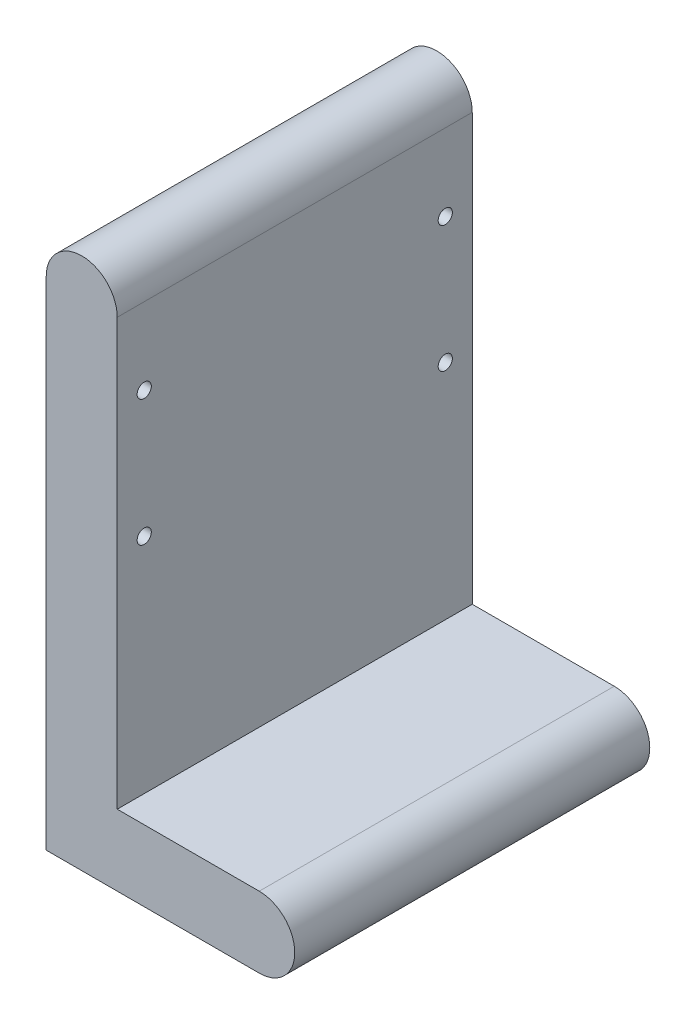
ISO-10303-21;
HEADER;
FILE_DESCRIPTION(('STEP AP214'),'2;1');
FILE_NAME('part.step','',(''),(''),'','','');
FILE_SCHEMA(('AUTOMOTIVE_DESIGN { 1 0 10303 214 1 1 1 1 }'));
ENDSEC;
DATA;
#1=APPLICATION_CONTEXT('core data for automotive mechanical design processes');
#2=APPLICATION_PROTOCOL_DEFINITION('international standard','automotive_design',2000,#1);
#3=PRODUCT_CONTEXT('',#1,'mechanical');
#4=PRODUCT('Part','Part','',(#3));
#5=PRODUCT_RELATED_PRODUCT_CATEGORY('part','',(#4));
#6=PRODUCT_DEFINITION_FORMATION('','',#4);
#7=PRODUCT_DEFINITION_CONTEXT('part definition',#1,'design');
#8=PRODUCT_DEFINITION('design','',#6,#7);
#9=PRODUCT_DEFINITION_SHAPE('','',#8);
#10=(LENGTH_UNIT() NAMED_UNIT(*) SI_UNIT(.MILLI.,.METRE.));
#11=(NAMED_UNIT(*) PLANE_ANGLE_UNIT() SI_UNIT($,.RADIAN.));
#12=(NAMED_UNIT(*) SI_UNIT($,.STERADIAN.) SOLID_ANGLE_UNIT());
#13=UNCERTAINTY_MEASURE_WITH_UNIT(LENGTH_MEASURE(1.E-05),#10,'distance_accuracy_value','');
#14=(GEOMETRIC_REPRESENTATION_CONTEXT(3) GLOBAL_UNCERTAINTY_ASSIGNED_CONTEXT((#13)) GLOBAL_UNIT_ASSIGNED_CONTEXT((#10,
#11,#12)) REPRESENTATION_CONTEXT('',''));
#15=CARTESIAN_POINT('',(0.,0.,0.));
#16=DIRECTION('',(0.,0.,1.));
#17=DIRECTION('',(1.,0.,0.));
#18=AXIS2_PLACEMENT_3D('',#15,#16,#17);
#19=CARTESIAN_POINT('',(-10.,60.,50.));
#20=DIRECTION('',(1.,0.,0.));
#21=DIRECTION('',(0.,1.,0.));
#22=AXIS2_PLACEMENT_3D('',#19,#20,#21);
#23=PLANE('',#22);
#24=CARTESIAN_POINT('',(-10.,49.2,46.2));
#25=DIRECTION('',(1.,0.,0.));
#26=DIRECTION('',(0.,0.,-1.));
#27=AXIS2_PLACEMENT_3D('',#24,#25,#26);
#28=CIRCLE('',#27,0.999999999999998);
#29=CARTESIAN_POINT('',(-10.,49.2,45.2));
#30=VERTEX_POINT('',#29);
#31=EDGE_CURVE('E160',#30,#30,#28,.T.);
#32=ORIENTED_EDGE('',*,*,#31,.T.);
#33=EDGE_LOOP('',(#32));
#34=FACE_BOUND('',#33,.T.);
#35=CARTESIAN_POINT('',(-10.,49.2,3.8));
#36=DIRECTION('',(-1.,0.,0.));
#37=DIRECTION('',(0.,0.,1.));
#38=AXIS2_PLACEMENT_3D('',#35,#36,#37);
#39=CIRCLE('',#38,1.);
#40=CARTESIAN_POINT('',(-10.,49.2,4.8));
#41=VERTEX_POINT('',#40);
#42=EDGE_CURVE('E177',#41,#41,#39,.T.);
#43=ORIENTED_EDGE('',*,*,#42,.F.);
#44=EDGE_LOOP('',(#43));
#45=FACE_BOUND('',#44,.T.);
#46=CARTESIAN_POINT('',(-10.,31.4,46.2));
#47=DIRECTION('',(-1.,0.,0.));
#48=DIRECTION('',(0.,0.,1.));
#49=AXIS2_PLACEMENT_3D('',#46,#47,#48);
#50=CIRCLE('',#49,1.00000000000001);
#51=CARTESIAN_POINT('',(-10.,31.4,47.2));
#52=VERTEX_POINT('',#51);
#53=EDGE_CURVE('E174',#52,#52,#50,.F.);
#54=ORIENTED_EDGE('',*,*,#53,.T.);
#55=EDGE_LOOP('',(#54));
#56=FACE_BOUND('',#55,.T.);
#57=DIRECTION('',(0.,-1.,0.));
#58=VECTOR('',#57,1.);
#59=CARTESIAN_POINT('',(-10.,60.,0.));
#60=LINE('',#59,#58);
#61=CARTESIAN_POINT('',(-10.,60.,0.));
#62=VERTEX_POINT('',#61);
#63=CARTESIAN_POINT('',(-10.,-10.,0.));
#64=VERTEX_POINT('',#63);
#65=EDGE_CURVE('E129',#62,#64,#60,.T.);
#66=ORIENTED_EDGE('',*,*,#65,.T.);
#67=DIRECTION('',(0.,0.,-1.));
#68=VECTOR('',#67,1.);
#69=CARTESIAN_POINT('',(-10.,-10.,50.));
#70=LINE('',#69,#68);
#71=CARTESIAN_POINT('',(-10.,-10.,50.));
#72=VERTEX_POINT('',#71);
#73=EDGE_CURVE('E50',#72,#64,#70,.T.);
#74=ORIENTED_EDGE('',*,*,#73,.F.);
#75=DIRECTION('',(0.,-1.,0.));
#76=VECTOR('',#75,1.);
#77=CARTESIAN_POINT('',(-10.,60.,50.));
#78=LINE('',#77,#76);
#79=CARTESIAN_POINT('',(-10.,60.,50.));
#80=VERTEX_POINT('',#79);
#81=EDGE_CURVE('E95',#80,#72,#78,.T.);
#82=ORIENTED_EDGE('',*,*,#81,.F.);
#83=DIRECTION('',(0.,0.,-1.));
#84=VECTOR('',#83,1.);
#85=CARTESIAN_POINT('',(-10.,60.,50.));
#86=LINE('',#85,#84);
#87=EDGE_CURVE('E11',#80,#62,#86,.T.);
#88=ORIENTED_EDGE('',*,*,#87,.T.);
#89=EDGE_LOOP('',(#66,#74,#82,#88));
#90=FACE_BOUND('',#89,.T.);
#91=CARTESIAN_POINT('',(-10.,31.4,3.8));
#92=DIRECTION('',(-1.,0.,0.));
#93=DIRECTION('',(0.,0.,1.));
#94=AXIS2_PLACEMENT_3D('',#91,#92,#93);
#95=CIRCLE('',#94,1.);
#96=CARTESIAN_POINT('',(-10.,31.4,4.8));
#97=VERTEX_POINT('',#96);
#98=EDGE_CURVE('E159',#97,#97,#95,.T.);
#99=ORIENTED_EDGE('',*,*,#98,.F.);
#100=EDGE_LOOP('',(#99));
#101=FACE_BOUND('',#100,.T.);
#102=ADVANCED_FACE('F41',(#34,#45,#56,#90,#101),#23,.F.);
#103=CARTESIAN_POINT('',(0.,60.,50.));
#104=DIRECTION('',(-1.,0.,0.));
#105=DIRECTION('',(0.,-1.,0.));
#106=AXIS2_PLACEMENT_3D('',#103,#104,#105);
#107=PLANE('',#106);
#108=CARTESIAN_POINT('',(0.,49.2,46.2));
#109=DIRECTION('',(1.,0.,0.));
#110=DIRECTION('',(0.,0.,-1.));
#111=AXIS2_PLACEMENT_3D('',#108,#109,#110);
#112=CIRCLE('',#111,0.999999999999998);
#113=CARTESIAN_POINT('',(0.,49.2,45.2));
#114=VERTEX_POINT('',#113);
#115=EDGE_CURVE('E166',#114,#114,#112,.T.);
#116=ORIENTED_EDGE('',*,*,#115,.F.);
#117=EDGE_LOOP('',(#116));
#118=FACE_BOUND('',#117,.T.);
#119=CARTESIAN_POINT('',(0.,49.2,3.8));
#120=DIRECTION('',(-1.,0.,0.));
#121=DIRECTION('',(0.,0.,1.));
#122=AXIS2_PLACEMENT_3D('',#119,#120,#121);
#123=CIRCLE('',#122,1.);
#124=CARTESIAN_POINT('',(0.,49.2,4.8));
#125=VERTEX_POINT('',#124);
#126=EDGE_CURVE('E163',#125,#125,#123,.T.);
#127=ORIENTED_EDGE('',*,*,#126,.T.);
#128=EDGE_LOOP('',(#127));
#129=FACE_BOUND('',#128,.T.);
#130=CARTESIAN_POINT('',(0.,31.4,46.2));
#131=DIRECTION('',(-1.,0.,0.));
#132=DIRECTION('',(0.,0.,1.));
#133=AXIS2_PLACEMENT_3D('',#130,#131,#132);
#134=CIRCLE('',#133,1.00000000000001);
#135=CARTESIAN_POINT('',(0.,31.4,47.2));
#136=VERTEX_POINT('',#135);
#137=EDGE_CURVE('E130',#136,#136,#134,.F.);
#138=ORIENTED_EDGE('',*,*,#137,.F.);
#139=EDGE_LOOP('',(#138));
#140=FACE_BOUND('',#139,.T.);
#141=DIRECTION('',(0.,1.,0.));
#142=VECTOR('',#141,1.);
#143=CARTESIAN_POINT('',(0.,60.,0.));
#144=LINE('',#143,#142);
#145=CARTESIAN_POINT('',(0.,0.,0.));
#146=VERTEX_POINT('',#145);
#147=CARTESIAN_POINT('',(0.,60.,0.));
#148=VERTEX_POINT('',#147);
#149=EDGE_CURVE('E87',#146,#148,#144,.T.);
#150=ORIENTED_EDGE('',*,*,#149,.T.);
#151=DIRECTION('',(0.,0.,-1.));
#152=VECTOR('',#151,1.);
#153=CARTESIAN_POINT('',(0.,60.,50.));
#154=LINE('',#153,#152);
#155=CARTESIAN_POINT('',(0.,60.,50.));
#156=VERTEX_POINT('',#155);
#157=EDGE_CURVE('E122',#156,#148,#154,.T.);
#158=ORIENTED_EDGE('',*,*,#157,.F.);
#159=DIRECTION('',(0.,1.,0.));
#160=VECTOR('',#159,1.);
#161=CARTESIAN_POINT('',(0.,60.,50.));
#162=LINE('',#161,#160);
#163=CARTESIAN_POINT('',(0.,0.,50.));
#164=VERTEX_POINT('',#163);
#165=EDGE_CURVE('E58',#164,#156,#162,.T.);
#166=ORIENTED_EDGE('',*,*,#165,.F.);
#167=DIRECTION('',(0.,0.,-1.));
#168=VECTOR('',#167,1.);
#169=CARTESIAN_POINT('',(0.,0.,50.));
#170=LINE('',#169,#168);
#171=EDGE_CURVE('E118',#164,#146,#170,.T.);
#172=ORIENTED_EDGE('',*,*,#171,.T.);
#173=EDGE_LOOP('',(#150,#158,#166,#172));
#174=FACE_BOUND('',#173,.T.);
#175=CARTESIAN_POINT('',(0.,31.4,3.8));
#176=DIRECTION('',(-1.,0.,0.));
#177=DIRECTION('',(0.,0.,1.));
#178=AXIS2_PLACEMENT_3D('',#175,#176,#177);
#179=CIRCLE('',#178,1.);
#180=CARTESIAN_POINT('',(0.,31.4,4.8));
#181=VERTEX_POINT('',#180);
#182=EDGE_CURVE('E157',#181,#181,#179,.T.);
#183=ORIENTED_EDGE('',*,*,#182,.T.);
#184=EDGE_LOOP('',(#183));
#185=FACE_BOUND('',#184,.T.);
#186=ADVANCED_FACE('F150',(#118,#129,#140,#174,#185),#107,.F.);
#187=CARTESIAN_POINT('',(-5.00000000000001,60.,50.));
#188=DIRECTION('',(0.,0.,-1.));
#189=DIRECTION('',(-1.,0.,0.));
#190=AXIS2_PLACEMENT_3D('',#187,#188,#189);
#191=CYLINDRICAL_SURFACE('',#190,5.);
#192=CARTESIAN_POINT('',(-5.00000000000001,60.,0.));
#193=DIRECTION('',(0.,0.,1.));
#194=DIRECTION('',(1.,0.,0.));
#195=AXIS2_PLACEMENT_3D('',#192,#193,#194);
#196=CIRCLE('',#195,5.);
#197=EDGE_CURVE('E126',#148,#62,#196,.T.);
#198=ORIENTED_EDGE('',*,*,#197,.T.);
#199=ORIENTED_EDGE('',*,*,#87,.F.);
#200=CARTESIAN_POINT('',(-5.00000000000001,60.,50.));
#201=DIRECTION('',(0.,0.,1.));
#202=DIRECTION('',(1.,0.,0.));
#203=AXIS2_PLACEMENT_3D('',#200,#201,#202);
#204=CIRCLE('',#203,5.);
#205=EDGE_CURVE('E137',#156,#80,#204,.T.);
#206=ORIENTED_EDGE('',*,*,#205,.F.);
#207=ORIENTED_EDGE('',*,*,#157,.T.);
#208=EDGE_LOOP('',(#198,#199,#206,#207));
#209=FACE_BOUND('',#208,.T.);
#210=ADVANCED_FACE('F43',(#209),#191,.T.);
#211=CARTESIAN_POINT('',(-10.,-10.,50.));
#212=DIRECTION('',(0.,1.,0.));
#213=DIRECTION('',(0.,0.,1.));
#214=AXIS2_PLACEMENT_3D('',#211,#212,#213);
#215=PLANE('',#214);
#216=DIRECTION('',(1.,0.,0.));
#217=VECTOR('',#216,1.);
#218=CARTESIAN_POINT('',(-10.,-10.,0.));
#219=LINE('',#218,#217);
#220=CARTESIAN_POINT('',(20.,-10.,0.));
#221=VERTEX_POINT('',#220);
#222=EDGE_CURVE('E132',#64,#221,#219,.T.);
#223=ORIENTED_EDGE('',*,*,#222,.T.);
#224=DIRECTION('',(0.,0.,-1.));
#225=VECTOR('',#224,1.);
#226=CARTESIAN_POINT('',(20.,-10.,50.));
#227=LINE('',#226,#225);
#228=CARTESIAN_POINT('',(20.,-10.,50.));
#229=VERTEX_POINT('',#228);
#230=EDGE_CURVE('E117',#229,#221,#227,.T.);
#231=ORIENTED_EDGE('',*,*,#230,.F.);
#232=DIRECTION('',(1.,0.,0.));
#233=VECTOR('',#232,1.);
#234=CARTESIAN_POINT('',(-10.,-10.,50.));
#235=LINE('',#234,#233);
#236=EDGE_CURVE('E108',#72,#229,#235,.T.);
#237=ORIENTED_EDGE('',*,*,#236,.F.);
#238=ORIENTED_EDGE('',*,*,#73,.T.);
#239=EDGE_LOOP('',(#223,#231,#237,#238));
#240=FACE_BOUND('',#239,.T.);
#241=ADVANCED_FACE('F143',(#240),#215,.F.);
#242=CARTESIAN_POINT('',(20.,-5.,50.));
#243=DIRECTION('',(0.,0.,-1.));
#244=DIRECTION('',(-1.,0.,0.));
#245=AXIS2_PLACEMENT_3D('',#242,#243,#244);
#246=CYLINDRICAL_SURFACE('',#245,5.);
#247=CARTESIAN_POINT('',(20.,-5.,0.));
#248=DIRECTION('',(0.,0.,1.));
#249=DIRECTION('',(-1.,0.,0.));
#250=AXIS2_PLACEMENT_3D('',#247,#248,#249);
#251=CIRCLE('',#250,5.);
#252=CARTESIAN_POINT('',(20.,0.,0.));
#253=VERTEX_POINT('',#252);
#254=EDGE_CURVE('E116',#221,#253,#251,.T.);
#255=ORIENTED_EDGE('',*,*,#254,.T.);
#256=DIRECTION('',(0.,0.,-1.));
#257=VECTOR('',#256,1.);
#258=CARTESIAN_POINT('',(20.,0.,50.));
#259=LINE('',#258,#257);
#260=CARTESIAN_POINT('',(20.,0.,50.));
#261=VERTEX_POINT('',#260);
#262=EDGE_CURVE('E113',#261,#253,#259,.T.);
#263=ORIENTED_EDGE('',*,*,#262,.F.);
#264=CARTESIAN_POINT('',(20.,-5.,50.));
#265=DIRECTION('',(0.,0.,1.));
#266=DIRECTION('',(-1.,0.,0.));
#267=AXIS2_PLACEMENT_3D('',#264,#265,#266);
#268=CIRCLE('',#267,5.);
#269=EDGE_CURVE('E102',#229,#261,#268,.T.);
#270=ORIENTED_EDGE('',*,*,#269,.F.);
#271=ORIENTED_EDGE('',*,*,#230,.T.);
#272=EDGE_LOOP('',(#255,#263,#270,#271));
#273=FACE_BOUND('',#272,.T.);
#274=ADVANCED_FACE('F114',(#273),#246,.T.);
#275=CARTESIAN_POINT('',(0.,0.,50.));
#276=DIRECTION('',(0.,-1.,0.));
#277=DIRECTION('',(0.,0.,-1.));
#278=AXIS2_PLACEMENT_3D('',#275,#276,#277);
#279=PLANE('',#278);
#280=DIRECTION('',(-1.,0.,0.));
#281=VECTOR('',#280,1.);
#282=CARTESIAN_POINT('',(0.,0.,0.));
#283=LINE('',#282,#281);
#284=EDGE_CURVE('E81',#253,#146,#283,.T.);
#285=ORIENTED_EDGE('',*,*,#284,.T.);
#286=ORIENTED_EDGE('',*,*,#171,.F.);
#287=DIRECTION('',(-1.,0.,0.));
#288=VECTOR('',#287,1.);
#289=CARTESIAN_POINT('',(0.,0.,50.));
#290=LINE('',#289,#288);
#291=EDGE_CURVE('E106',#261,#164,#290,.T.);
#292=ORIENTED_EDGE('',*,*,#291,.F.);
#293=ORIENTED_EDGE('',*,*,#262,.T.);
#294=EDGE_LOOP('',(#285,#286,#292,#293));
#295=FACE_BOUND('',#294,.T.);
#296=ADVANCED_FACE('F120',(#295),#279,.F.);
#297=CARTESIAN_POINT('',(-5.00000000000001,60.,50.));
#298=DIRECTION('',(0.,0.,1.));
#299=DIRECTION('',(1.,0.,0.));
#300=AXIS2_PLACEMENT_3D('',#297,#298,#299);
#301=PLANE('',#300);
#302=ORIENTED_EDGE('',*,*,#205,.T.);
#303=ORIENTED_EDGE('',*,*,#81,.T.);
#304=ORIENTED_EDGE('',*,*,#236,.T.);
#305=ORIENTED_EDGE('',*,*,#269,.T.);
#306=ORIENTED_EDGE('',*,*,#291,.T.);
#307=ORIENTED_EDGE('',*,*,#165,.T.);
#308=EDGE_LOOP('',(#302,#303,#304,#305,#306,#307));
#309=FACE_BOUND('',#308,.T.);
#310=ADVANCED_FACE('F104',(#309),#301,.T.);
#311=CARTESIAN_POINT('',(-5.00000000000001,60.,0.));
#312=DIRECTION('',(0.,0.,1.));
#313=DIRECTION('',(1.,0.,0.));
#314=AXIS2_PLACEMENT_3D('',#311,#312,#313);
#315=PLANE('',#314);
#316=ORIENTED_EDGE('',*,*,#197,.F.);
#317=ORIENTED_EDGE('',*,*,#149,.F.);
#318=ORIENTED_EDGE('',*,*,#284,.F.);
#319=ORIENTED_EDGE('',*,*,#254,.F.);
#320=ORIENTED_EDGE('',*,*,#222,.F.);
#321=ORIENTED_EDGE('',*,*,#65,.F.);
#322=EDGE_LOOP('',(#316,#317,#318,#319,#320,#321));
#323=FACE_BOUND('',#322,.T.);
#324=ADVANCED_FACE('F146',(#323),#315,.F.);
#325=CARTESIAN_POINT('',(0.,31.4,46.2));
#326=DIRECTION('',(-1.,0.,0.));
#327=DIRECTION('',(0.,0.,1.));
#328=AXIS2_PLACEMENT_3D('',#325,#326,#327);
#329=CYLINDRICAL_SURFACE('',#328,1.00000000000001);
#330=ORIENTED_EDGE('',*,*,#137,.T.);
#331=EDGE_LOOP('',(#330));
#332=FACE_BOUND('',#331,.T.);
#333=ORIENTED_EDGE('',*,*,#53,.F.);
#334=EDGE_LOOP('',(#333));
#335=FACE_BOUND('',#334,.T.);
#336=ADVANCED_FACE('F193',(#332,#335),#329,.F.);
#337=CARTESIAN_POINT('',(0.,49.2,3.8));
#338=DIRECTION('',(-1.,0.,0.));
#339=DIRECTION('',(0.,0.,1.));
#340=AXIS2_PLACEMENT_3D('',#337,#338,#339);
#341=CYLINDRICAL_SURFACE('',#340,1.);
#342=ORIENTED_EDGE('',*,*,#126,.F.);
#343=EDGE_LOOP('',(#342));
#344=FACE_BOUND('',#343,.T.);
#345=ORIENTED_EDGE('',*,*,#42,.T.);
#346=EDGE_LOOP('',(#345));
#347=FACE_BOUND('',#346,.T.);
#348=ADVANCED_FACE('F190',(#344,#347),#341,.F.);
#349=CARTESIAN_POINT('',(0.,31.4,3.8));
#350=DIRECTION('',(-1.,0.,0.));
#351=DIRECTION('',(0.,0.,1.));
#352=AXIS2_PLACEMENT_3D('',#349,#350,#351);
#353=CYLINDRICAL_SURFACE('',#352,1.);
#354=ORIENTED_EDGE('',*,*,#182,.F.);
#355=EDGE_LOOP('',(#354));
#356=FACE_BOUND('',#355,.T.);
#357=ORIENTED_EDGE('',*,*,#98,.T.);
#358=EDGE_LOOP('',(#357));
#359=FACE_BOUND('',#358,.T.);
#360=ADVANCED_FACE('F192',(#356,#359),#353,.F.);
#361=CARTESIAN_POINT('',(0.,49.2,46.2));
#362=DIRECTION('',(-1.,0.,0.));
#363=DIRECTION('',(0.,0.,1.));
#364=AXIS2_PLACEMENT_3D('',#361,#362,#363);
#365=CYLINDRICAL_SURFACE('',#364,0.999999999999998);
#366=ORIENTED_EDGE('',*,*,#115,.T.);
#367=EDGE_LOOP('',(#366));
#368=FACE_BOUND('',#367,.T.);
#369=ORIENTED_EDGE('',*,*,#31,.F.);
#370=EDGE_LOOP('',(#369));
#371=FACE_BOUND('',#370,.T.);
#372=ADVANCED_FACE('F199',(#368,#371),#365,.F.);
#373=CLOSED_SHELL('',(#102,#186,#210,#241,#274,#296,#310,#324,#336,#348,#360,#372));
#374=MANIFOLD_SOLID_BREP('B2',#373);
#375=ADVANCED_BREP_SHAPE_REPRESENTATION('',(#18,#374),#14);
#376=SHAPE_DEFINITION_REPRESENTATION(#9,#375);
ENDSEC;
END-ISO-10303-21;
